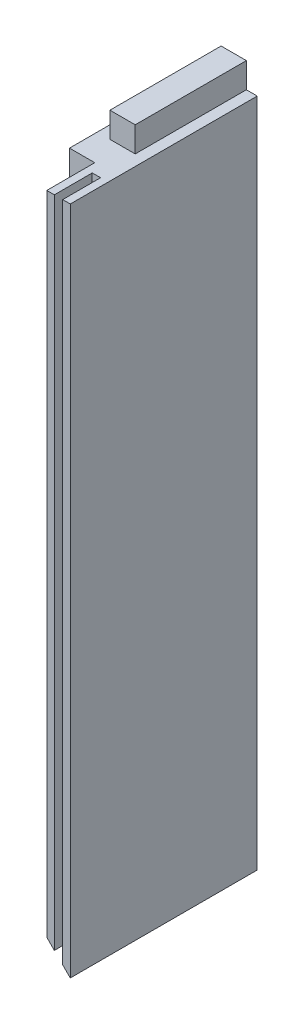
ISO-10303-21;
HEADER;
FILE_DESCRIPTION(('STEP AP214'),'2;1');
FILE_NAME('part.step','',(''),(''),'','','');
FILE_SCHEMA(('AUTOMOTIVE_DESIGN { 1 0 10303 214 1 1 1 1 }'));
ENDSEC;
DATA;
#1=APPLICATION_CONTEXT('core data for automotive mechanical design processes');
#2=APPLICATION_PROTOCOL_DEFINITION('international standard','automotive_design',2000,#1);
#3=PRODUCT_CONTEXT('',#1,'mechanical');
#4=PRODUCT('Part','Part','',(#3));
#5=PRODUCT_RELATED_PRODUCT_CATEGORY('part','',(#4));
#6=PRODUCT_DEFINITION_FORMATION('','',#4);
#7=PRODUCT_DEFINITION_CONTEXT('part definition',#1,'design');
#8=PRODUCT_DEFINITION('design','',#6,#7);
#9=PRODUCT_DEFINITION_SHAPE('','',#8);
#10=(LENGTH_UNIT() NAMED_UNIT(*) SI_UNIT(.MILLI.,.METRE.));
#11=(NAMED_UNIT(*) PLANE_ANGLE_UNIT() SI_UNIT($,.RADIAN.));
#12=(NAMED_UNIT(*) SI_UNIT($,.STERADIAN.) SOLID_ANGLE_UNIT());
#13=UNCERTAINTY_MEASURE_WITH_UNIT(LENGTH_MEASURE(1.E-05),#10,'distance_accuracy_value','');
#14=(GEOMETRIC_REPRESENTATION_CONTEXT(3) GLOBAL_UNCERTAINTY_ASSIGNED_CONTEXT((#13)) GLOBAL_UNIT_ASSIGNED_CONTEXT((#10,
#11,#12)) REPRESENTATION_CONTEXT('',''));
#15=CARTESIAN_POINT('',(0.,0.,0.));
#16=DIRECTION('',(0.,0.,1.));
#17=DIRECTION('',(1.,0.,0.));
#18=AXIS2_PLACEMENT_3D('',#15,#16,#17);
#19=CARTESIAN_POINT('',(-16.1028976870908,-16.1028976870907,0.));
#20=DIRECTION('',(-0.707106781186549,-0.707106781186546,0.));
#21=DIRECTION('',(0.707106781186546,-0.707106781186549,0.));
#22=AXIS2_PLACEMENT_3D('',#19,#20,#21);
#23=PLANE('',#22);
#24=DIRECTION('',(0.707106781186546,-0.707106781186549,0.));
#25=VECTOR('',#24,1.);
#26=CARTESIAN_POINT('',(-164.855795374181,132.65,-37.));
#27=LINE('',#26,#25);
#28=CARTESIAN_POINT('',(-51.5057953741814,19.3000000000001,-37.));
#29=VERTEX_POINT('',#28);
#30=CARTESIAN_POINT('',(-32.2057953741814,0.,-37.));
#31=VERTEX_POINT('',#30);
#32=EDGE_CURVE('E225',#29,#31,#27,.T.);
#33=ORIENTED_EDGE('',*,*,#32,.T.);
#34=DIRECTION('',(0.,0.,-1.));
#35=VECTOR('',#34,1.);
#36=CARTESIAN_POINT('',(-32.2057953741814,0.,37.));
#37=LINE('',#36,#35);
#38=CARTESIAN_POINT('',(-32.2057953741814,0.,37.));
#39=VERTEX_POINT('',#38);
#40=EDGE_CURVE('E266',#39,#31,#37,.T.);
#41=ORIENTED_EDGE('',*,*,#40,.F.);
#42=DIRECTION('',(-0.707106781186546,0.707106781186549,0.));
#43=VECTOR('',#42,1.);
#44=CARTESIAN_POINT('',(-166.355795374181,134.15,37.));
#45=LINE('',#44,#43);
#46=CARTESIAN_POINT('',(-35.2057953741814,2.99999999999995,37.));
#47=VERTEX_POINT('',#46);
#48=EDGE_CURVE('E196',#39,#47,#45,.T.);
#49=ORIENTED_EDGE('',*,*,#48,.T.);
#50=DIRECTION('',(0.,0.,-1.));
#51=VECTOR('',#50,1.);
#52=CARTESIAN_POINT('',(-35.2057953741814,3.,22.));
#53=LINE('',#52,#51);
#54=CARTESIAN_POINT('',(-35.2057953741814,3.,22.));
#55=VERTEX_POINT('',#54);
#56=EDGE_CURVE('E200',#47,#55,#53,.T.);
#57=ORIENTED_EDGE('',*,*,#56,.T.);
#58=DIRECTION('',(-0.707106781186546,0.707106781186549,0.));
#59=VECTOR('',#58,1.);
#60=CARTESIAN_POINT('',(-168.005795374181,135.8,22.));
#61=LINE('',#60,#59);
#62=CARTESIAN_POINT('',(-38.5057953741814,6.29999999999997,22.));
#63=VERTEX_POINT('',#62);
#64=EDGE_CURVE('E207',#55,#63,#61,.T.);
#65=ORIENTED_EDGE('',*,*,#64,.T.);
#66=DIRECTION('',(0.,0.,1.));
#67=VECTOR('',#66,1.);
#68=CARTESIAN_POINT('',(-38.5057953741814,6.30000000000003,37.));
#69=LINE('',#68,#67);
#70=CARTESIAN_POINT('',(-38.5057953741814,6.30000000000003,37.));
#71=VERTEX_POINT('',#70);
#72=EDGE_CURVE('E210',#63,#71,#69,.T.);
#73=ORIENTED_EDGE('',*,*,#72,.T.);
#74=DIRECTION('',(-0.707106781186546,0.707106781186549,0.));
#75=VECTOR('',#74,1.);
#76=CARTESIAN_POINT('',(-169.505795374181,137.3,37.));
#77=LINE('',#76,#75);
#78=CARTESIAN_POINT('',(-41.5057953741814,9.29999999999998,37.));
#79=VERTEX_POINT('',#78);
#80=EDGE_CURVE('E213',#71,#79,#77,.T.);
#81=ORIENTED_EDGE('',*,*,#80,.T.);
#82=DIRECTION('',(0.,0.,-1.));
#83=VECTOR('',#82,1.);
#84=CARTESIAN_POINT('',(-41.5057953741814,9.30000000000003,18.));
#85=LINE('',#84,#83);
#86=CARTESIAN_POINT('',(-41.5057953741814,9.30000000000003,18.));
#87=VERTEX_POINT('',#86);
#88=EDGE_CURVE('E216',#79,#87,#85,.T.);
#89=ORIENTED_EDGE('',*,*,#88,.T.);
#90=DIRECTION('',(-0.707106781186546,0.707106781186549,0.));
#91=VECTOR('',#90,1.);
#92=CARTESIAN_POINT('',(-174.505795374181,142.3,18.));
#93=LINE('',#92,#91);
#94=CARTESIAN_POINT('',(-51.5057953741814,19.3,18.));
#95=VERTEX_POINT('',#94);
#96=EDGE_CURVE('E219',#87,#95,#93,.T.);
#97=ORIENTED_EDGE('',*,*,#96,.T.);
#98=DIRECTION('',(0.,0.,-1.));
#99=VECTOR('',#98,1.);
#100=CARTESIAN_POINT('',(-51.5057953741814,19.3000000000001,-37.));
#101=LINE('',#100,#99);
#102=EDGE_CURVE('E222',#95,#29,#101,.T.);
#103=ORIENTED_EDGE('',*,*,#102,.T.);
#104=EDGE_LOOP('',(#33,#41,#49,#57,#65,#73,#81,#89,#97,#103));
#105=FACE_BOUND('',#104,.T.);
#106=DIRECTION('',(0.,0.,1.));
#107=VECTOR('',#106,1.);
#108=CARTESIAN_POINT('',(-42.3134072187563,10.1076118445749,-25.));
#109=LINE('',#108,#107);
#110=CARTESIAN_POINT('',(-42.3134072187563,10.1076118445749,-25.));
#111=VERTEX_POINT('',#110);
#112=CARTESIAN_POINT('',(-42.3134072187563,10.1076118445749,2.99999999999999));
#113=VERTEX_POINT('',#112);
#114=EDGE_CURVE('E624',#111,#113,#109,.T.);
#115=ORIENTED_EDGE('',*,*,#114,.F.);
#116=DIRECTION('',(0.707106781186546,-0.707106781186549,0.));
#117=VECTOR('',#116,1.);
#118=CARTESIAN_POINT('',(-47.2631546870621,15.0573593128807,-25.));
#119=LINE('',#118,#117);
#120=CARTESIAN_POINT('',(-47.2631546870621,15.0573593128807,-25.));
#121=VERTEX_POINT('',#120);
#122=EDGE_CURVE('E193',#121,#111,#119,.T.);
#123=ORIENTED_EDGE('',*,*,#122,.F.);
#124=DIRECTION('',(0.,0.,-1.));
#125=VECTOR('',#124,1.);
#126=CARTESIAN_POINT('',(-47.2631546870621,15.0573593128807,-25.));
#127=LINE('',#126,#125);
#128=CARTESIAN_POINT('',(-47.2631546870621,15.0573593128808,2.99999999999999));
#129=VERTEX_POINT('',#128);
#130=EDGE_CURVE('E189',#129,#121,#127,.T.);
#131=ORIENTED_EDGE('',*,*,#130,.F.);
#132=DIRECTION('',(-0.707106781186546,0.707106781186549,0.));
#133=VECTOR('',#132,1.);
#134=CARTESIAN_POINT('',(-47.2631546870621,15.0573593128807,2.99999999999999));
#135=LINE('',#134,#133);
#136=EDGE_CURVE('E620',#113,#129,#135,.T.);
#137=ORIENTED_EDGE('',*,*,#136,.F.);
#138=EDGE_LOOP('',(#115,#123,#131,#137));
#139=FACE_BOUND('',#138,.T.);
#140=ADVANCED_FACE('F42',(#105,#139),#23,.T.);
#141=CARTESIAN_POINT('',(-32.2057953741814,265.3,-37.));
#142=DIRECTION('',(0.,0.,1.));
#143=DIRECTION('',(1.,0.,0.));
#144=AXIS2_PLACEMENT_3D('',#141,#142,#143);
#145=PLANE('',#144);
#146=ORIENTED_EDGE('',*,*,#32,.F.);
#147=DIRECTION('',(0.,-1.,0.));
#148=VECTOR('',#147,1.);
#149=CARTESIAN_POINT('',(-51.5057953741814,265.3,-37.));
#150=LINE('',#149,#148);
#151=CARTESIAN_POINT('',(-51.5057953741814,265.3,-37.));
#152=VERTEX_POINT('',#151);
#153=EDGE_CURVE('E11',#152,#29,#150,.T.);
#154=ORIENTED_EDGE('',*,*,#153,.F.);
#155=DIRECTION('',(-1.,0.,0.));
#156=VECTOR('',#155,1.);
#157=CARTESIAN_POINT('',(-32.2057953741814,265.3,-37.));
#158=LINE('',#157,#156);
#159=CARTESIAN_POINT('',(-46.5057953741814,265.3,-37.));
#160=VERTEX_POINT('',#159);
#161=EDGE_CURVE('E271',#160,#152,#158,.T.);
#162=ORIENTED_EDGE('',*,*,#161,.F.);
#163=DIRECTION('',(0.,-1.,0.));
#164=VECTOR('',#163,1.);
#165=CARTESIAN_POINT('',(-46.5057953741814,275.3,-37.));
#166=LINE('',#165,#164);
#167=CARTESIAN_POINT('',(-46.5057953741814,275.3,-37.));
#168=VERTEX_POINT('',#167);
#169=EDGE_CURVE('E243',#168,#160,#166,.T.);
#170=ORIENTED_EDGE('',*,*,#169,.F.);
#171=DIRECTION('',(-1.,0.,0.));
#172=VECTOR('',#171,1.);
#173=CARTESIAN_POINT('',(-46.5057953741814,275.3,-37.));
#174=LINE('',#173,#172);
#175=CARTESIAN_POINT('',(-36.5057953741814,275.3,-37.));
#176=VERTEX_POINT('',#175);
#177=EDGE_CURVE('E240',#176,#168,#174,.T.);
#178=ORIENTED_EDGE('',*,*,#177,.F.);
#179=DIRECTION('',(0.,-1.,0.));
#180=VECTOR('',#179,1.);
#181=CARTESIAN_POINT('',(-36.5057953741814,275.3,-37.));
#182=LINE('',#181,#180);
#183=CARTESIAN_POINT('',(-36.5057953741814,265.3,-37.));
#184=VERTEX_POINT('',#183);
#185=EDGE_CURVE('E255',#176,#184,#182,.T.);
#186=ORIENTED_EDGE('',*,*,#185,.T.);
#187=CARTESIAN_POINT('',(-32.2057953741814,265.3,-37.));
#188=VERTEX_POINT('',#187);
#189=EDGE_CURVE('E267',#188,#184,#158,.T.);
#190=ORIENTED_EDGE('',*,*,#189,.F.);
#191=DIRECTION('',(0.,-1.,0.));
#192=VECTOR('',#191,1.);
#193=CARTESIAN_POINT('',(-32.2057953741814,265.3,-37.));
#194=LINE('',#193,#192);
#195=EDGE_CURVE('E298',#188,#31,#194,.T.);
#196=ORIENTED_EDGE('',*,*,#195,.T.);
#197=EDGE_LOOP('',(#146,#154,#162,#170,#178,#186,#190,#196));
#198=FACE_BOUND('',#197,.T.);
#199=ADVANCED_FACE('F44',(#198),#145,.F.);
#200=CARTESIAN_POINT('',(-51.5057953741814,265.3,-37.));
#201=DIRECTION('',(1.,0.,0.));
#202=DIRECTION('',(0.,0.,-1.));
#203=AXIS2_PLACEMENT_3D('',#200,#201,#202);
#204=PLANE('',#203);
#205=ORIENTED_EDGE('',*,*,#102,.F.);
#206=DIRECTION('',(0.,-1.,0.));
#207=VECTOR('',#206,1.);
#208=CARTESIAN_POINT('',(-51.5057953741814,265.3,18.));
#209=LINE('',#208,#207);
#210=CARTESIAN_POINT('',(-51.5057953741814,265.3,18.));
#211=VERTEX_POINT('',#210);
#212=EDGE_CURVE('E51',#211,#95,#209,.T.);
#213=ORIENTED_EDGE('',*,*,#212,.F.);
#214=DIRECTION('',(0.,0.,1.));
#215=VECTOR('',#214,1.);
#216=CARTESIAN_POINT('',(-51.5057953741814,265.3,-37.));
#217=LINE('',#216,#215);
#218=EDGE_CURVE('E270',#152,#211,#217,.T.);
#219=ORIENTED_EDGE('',*,*,#218,.F.);
#220=ORIENTED_EDGE('',*,*,#153,.T.);
#221=EDGE_LOOP('',(#205,#213,#219,#220));
#222=FACE_BOUND('',#221,.T.);
#223=ADVANCED_FACE('F343',(#222),#204,.F.);
#224=CARTESIAN_POINT('',(-51.5057953741814,265.3,18.));
#225=DIRECTION('',(0.,0.,-1.));
#226=DIRECTION('',(-1.,0.,0.));
#227=AXIS2_PLACEMENT_3D('',#224,#225,#226);
#228=PLANE('',#227);
#229=ORIENTED_EDGE('',*,*,#96,.F.);
#230=DIRECTION('',(0.,-1.,0.));
#231=VECTOR('',#230,1.);
#232=CARTESIAN_POINT('',(-41.5057953741814,265.3,18.));
#233=LINE('',#232,#231);
#234=CARTESIAN_POINT('',(-41.5057953741814,265.3,18.));
#235=VERTEX_POINT('',#234);
#236=EDGE_CURVE('E329',#235,#87,#233,.T.);
#237=ORIENTED_EDGE('',*,*,#236,.F.);
#238=DIRECTION('',(1.,0.,0.));
#239=VECTOR('',#238,1.);
#240=CARTESIAN_POINT('',(-51.5057953741814,265.3,18.));
#241=LINE('',#240,#239);
#242=EDGE_CURVE('E274',#211,#235,#241,.T.);
#243=ORIENTED_EDGE('',*,*,#242,.F.);
#244=ORIENTED_EDGE('',*,*,#212,.T.);
#245=EDGE_LOOP('',(#229,#237,#243,#244));
#246=FACE_BOUND('',#245,.T.);
#247=ADVANCED_FACE('F338',(#246),#228,.F.);
#248=CARTESIAN_POINT('',(-41.5057953741814,265.3,18.));
#249=DIRECTION('',(1.,0.,0.));
#250=DIRECTION('',(0.,0.,-1.));
#251=AXIS2_PLACEMENT_3D('',#248,#249,#250);
#252=PLANE('',#251);
#253=ORIENTED_EDGE('',*,*,#88,.F.);
#254=DIRECTION('',(0.,-1.,0.));
#255=VECTOR('',#254,1.);
#256=CARTESIAN_POINT('',(-41.5057953741814,265.3,37.));
#257=LINE('',#256,#255);
#258=CARTESIAN_POINT('',(-41.5057953741814,265.3,37.));
#259=VERTEX_POINT('',#258);
#260=EDGE_CURVE('E325',#259,#79,#257,.T.);
#261=ORIENTED_EDGE('',*,*,#260,.F.);
#262=DIRECTION('',(0.,0.,1.));
#263=VECTOR('',#262,1.);
#264=CARTESIAN_POINT('',(-41.5057953741814,265.3,18.));
#265=LINE('',#264,#263);
#266=EDGE_CURVE('E277',#235,#259,#265,.T.);
#267=ORIENTED_EDGE('',*,*,#266,.F.);
#268=ORIENTED_EDGE('',*,*,#236,.T.);
#269=EDGE_LOOP('',(#253,#261,#267,#268));
#270=FACE_BOUND('',#269,.T.);
#271=ADVANCED_FACE('F384',(#270),#252,.F.);
#272=CARTESIAN_POINT('',(-41.5057953741814,265.3,37.));
#273=DIRECTION('',(0.,0.,-1.));
#274=DIRECTION('',(-1.,0.,0.));
#275=AXIS2_PLACEMENT_3D('',#272,#273,#274);
#276=PLANE('',#275);
#277=ORIENTED_EDGE('',*,*,#80,.F.);
#278=DIRECTION('',(0.,-1.,0.));
#279=VECTOR('',#278,1.);
#280=CARTESIAN_POINT('',(-38.5057953741814,265.3,37.));
#281=LINE('',#280,#279);
#282=CARTESIAN_POINT('',(-38.5057953741814,265.3,37.));
#283=VERTEX_POINT('',#282);
#284=EDGE_CURVE('E321',#283,#71,#281,.T.);
#285=ORIENTED_EDGE('',*,*,#284,.F.);
#286=DIRECTION('',(1.,0.,0.));
#287=VECTOR('',#286,1.);
#288=CARTESIAN_POINT('',(-41.5057953741814,265.3,37.));
#289=LINE('',#288,#287);
#290=EDGE_CURVE('E280',#259,#283,#289,.T.);
#291=ORIENTED_EDGE('',*,*,#290,.F.);
#292=ORIENTED_EDGE('',*,*,#260,.T.);
#293=EDGE_LOOP('',(#277,#285,#291,#292));
#294=FACE_BOUND('',#293,.T.);
#295=ADVANCED_FACE('F379',(#294),#276,.F.);
#296=CARTESIAN_POINT('',(-38.5057953741814,265.3,37.));
#297=DIRECTION('',(-1.,0.,0.));
#298=DIRECTION('',(0.,0.,1.));
#299=AXIS2_PLACEMENT_3D('',#296,#297,#298);
#300=PLANE('',#299);
#301=ORIENTED_EDGE('',*,*,#72,.F.);
#302=DIRECTION('',(0.,-1.,0.));
#303=VECTOR('',#302,1.);
#304=CARTESIAN_POINT('',(-38.5057953741814,265.3,22.));
#305=LINE('',#304,#303);
#306=CARTESIAN_POINT('',(-38.5057953741814,265.3,22.));
#307=VERTEX_POINT('',#306);
#308=EDGE_CURVE('E317',#307,#63,#305,.T.);
#309=ORIENTED_EDGE('',*,*,#308,.F.);
#310=DIRECTION('',(0.,0.,-1.));
#311=VECTOR('',#310,1.);
#312=CARTESIAN_POINT('',(-38.5057953741814,265.3,37.));
#313=LINE('',#312,#311);
#314=EDGE_CURVE('E283',#283,#307,#313,.T.);
#315=ORIENTED_EDGE('',*,*,#314,.F.);
#316=ORIENTED_EDGE('',*,*,#284,.T.);
#317=EDGE_LOOP('',(#301,#309,#315,#316));
#318=FACE_BOUND('',#317,.T.);
#319=ADVANCED_FACE('F374',(#318),#300,.F.);
#320=CARTESIAN_POINT('',(-38.5057953741814,265.3,22.));
#321=DIRECTION('',(0.,0.,-1.));
#322=DIRECTION('',(-1.,0.,0.));
#323=AXIS2_PLACEMENT_3D('',#320,#321,#322);
#324=PLANE('',#323);
#325=ORIENTED_EDGE('',*,*,#64,.F.);
#326=DIRECTION('',(0.,-1.,0.));
#327=VECTOR('',#326,1.);
#328=CARTESIAN_POINT('',(-35.2057953741814,265.3,22.));
#329=LINE('',#328,#327);
#330=CARTESIAN_POINT('',(-35.2057953741814,265.3,22.));
#331=VERTEX_POINT('',#330);
#332=EDGE_CURVE('E313',#331,#55,#329,.T.);
#333=ORIENTED_EDGE('',*,*,#332,.F.);
#334=DIRECTION('',(1.,0.,0.));
#335=VECTOR('',#334,1.);
#336=CARTESIAN_POINT('',(-38.5057953741814,265.3,22.));
#337=LINE('',#336,#335);
#338=EDGE_CURVE('E286',#307,#331,#337,.T.);
#339=ORIENTED_EDGE('',*,*,#338,.F.);
#340=ORIENTED_EDGE('',*,*,#308,.T.);
#341=EDGE_LOOP('',(#325,#333,#339,#340));
#342=FACE_BOUND('',#341,.T.);
#343=ADVANCED_FACE('F369',(#342),#324,.F.);
#344=CARTESIAN_POINT('',(-35.2057953741814,265.3,22.));
#345=DIRECTION('',(1.,0.,0.));
#346=DIRECTION('',(0.,0.,-1.));
#347=AXIS2_PLACEMENT_3D('',#344,#345,#346);
#348=PLANE('',#347);
#349=ORIENTED_EDGE('',*,*,#56,.F.);
#350=DIRECTION('',(0.,-1.,0.));
#351=VECTOR('',#350,1.);
#352=CARTESIAN_POINT('',(-35.2057953741814,265.3,37.));
#353=LINE('',#352,#351);
#354=CARTESIAN_POINT('',(-35.2057953741814,265.3,37.));
#355=VERTEX_POINT('',#354);
#356=EDGE_CURVE('E309',#355,#47,#353,.T.);
#357=ORIENTED_EDGE('',*,*,#356,.F.);
#358=DIRECTION('',(0.,0.,1.));
#359=VECTOR('',#358,1.);
#360=CARTESIAN_POINT('',(-35.2057953741814,265.3,22.));
#361=LINE('',#360,#359);
#362=EDGE_CURVE('E289',#331,#355,#361,.T.);
#363=ORIENTED_EDGE('',*,*,#362,.F.);
#364=ORIENTED_EDGE('',*,*,#332,.T.);
#365=EDGE_LOOP('',(#349,#357,#363,#364));
#366=FACE_BOUND('',#365,.T.);
#367=ADVANCED_FACE('F364',(#366),#348,.F.);
#368=CARTESIAN_POINT('',(-35.2057953741814,265.3,37.));
#369=DIRECTION('',(0.,0.,-1.));
#370=DIRECTION('',(-1.,0.,0.));
#371=AXIS2_PLACEMENT_3D('',#368,#369,#370);
#372=PLANE('',#371);
#373=ORIENTED_EDGE('',*,*,#48,.F.);
#374=DIRECTION('',(0.,-1.,0.));
#375=VECTOR('',#374,1.);
#376=CARTESIAN_POINT('',(-32.2057953741814,265.3,37.));
#377=LINE('',#376,#375);
#378=CARTESIAN_POINT('',(-32.2057953741814,265.3,37.));
#379=VERTEX_POINT('',#378);
#380=EDGE_CURVE('E305',#379,#39,#377,.T.);
#381=ORIENTED_EDGE('',*,*,#380,.F.);
#382=DIRECTION('',(1.,0.,0.));
#383=VECTOR('',#382,1.);
#384=CARTESIAN_POINT('',(-35.2057953741814,265.3,37.));
#385=LINE('',#384,#383);
#386=EDGE_CURVE('E292',#355,#379,#385,.T.);
#387=ORIENTED_EDGE('',*,*,#386,.F.);
#388=ORIENTED_EDGE('',*,*,#356,.T.);
#389=EDGE_LOOP('',(#373,#381,#387,#388));
#390=FACE_BOUND('',#389,.T.);
#391=ADVANCED_FACE('F359',(#390),#372,.F.);
#392=CARTESIAN_POINT('',(-32.2057953741814,265.3,37.));
#393=DIRECTION('',(-1.,0.,0.));
#394=DIRECTION('',(0.,0.,1.));
#395=AXIS2_PLACEMENT_3D('',#392,#393,#394);
#396=PLANE('',#395);
#397=ORIENTED_EDGE('',*,*,#40,.T.);
#398=ORIENTED_EDGE('',*,*,#195,.F.);
#399=DIRECTION('',(0.,0.,-1.));
#400=VECTOR('',#399,1.);
#401=CARTESIAN_POINT('',(-32.2057953741814,265.3,37.));
#402=LINE('',#401,#400);
#403=EDGE_CURVE('E295',#379,#188,#402,.T.);
#404=ORIENTED_EDGE('',*,*,#403,.F.);
#405=ORIENTED_EDGE('',*,*,#380,.T.);
#406=EDGE_LOOP('',(#397,#398,#404,#405));
#407=FACE_BOUND('',#406,.T.);
#408=ADVANCED_FACE('F354',(#407),#396,.F.);
#409=CARTESIAN_POINT('',(0.,265.3,0.));
#410=DIRECTION('',(0.,1.,0.));
#411=DIRECTION('',(0.,0.,1.));
#412=AXIS2_PLACEMENT_3D('',#409,#410,#411);
#413=PLANE('',#412);
#414=DIRECTION('',(0.,0.,1.));
#415=VECTOR('',#414,1.);
#416=CARTESIAN_POINT('',(-46.5057953741814,265.3,7.));
#417=LINE('',#416,#415);
#418=CARTESIAN_POINT('',(-46.5057953741814,265.3,7.));
#419=VERTEX_POINT('',#418);
#420=EDGE_CURVE('E228',#160,#419,#417,.T.);
#421=ORIENTED_EDGE('',*,*,#420,.F.);
#422=ORIENTED_EDGE('',*,*,#161,.T.);
#423=ORIENTED_EDGE('',*,*,#218,.T.);
#424=ORIENTED_EDGE('',*,*,#242,.T.);
#425=ORIENTED_EDGE('',*,*,#266,.T.);
#426=ORIENTED_EDGE('',*,*,#290,.T.);
#427=ORIENTED_EDGE('',*,*,#314,.T.);
#428=ORIENTED_EDGE('',*,*,#338,.T.);
#429=ORIENTED_EDGE('',*,*,#362,.T.);
#430=ORIENTED_EDGE('',*,*,#386,.T.);
#431=ORIENTED_EDGE('',*,*,#403,.T.);
#432=ORIENTED_EDGE('',*,*,#189,.T.);
#433=DIRECTION('',(0.,0.,-1.));
#434=VECTOR('',#433,1.);
#435=CARTESIAN_POINT('',(-36.5057953741814,265.3,-37.));
#436=LINE('',#435,#434);
#437=CARTESIAN_POINT('',(-36.5057953741814,265.3,7.));
#438=VERTEX_POINT('',#437);
#439=EDGE_CURVE('E234',#438,#184,#436,.T.);
#440=ORIENTED_EDGE('',*,*,#439,.F.);
#441=DIRECTION('',(1.,0.,0.));
#442=VECTOR('',#441,1.);
#443=CARTESIAN_POINT('',(-36.5057953741814,265.3,7.));
#444=LINE('',#443,#442);
#445=EDGE_CURVE('E66',#419,#438,#444,.T.);
#446=ORIENTED_EDGE('',*,*,#445,.F.);
#447=EDGE_LOOP('',(#421,#422,#423,#424,#425,#426,#427,#428,#429,#430,#431,#432,#440,#446));
#448=FACE_BOUND('',#447,.T.);
#449=ADVANCED_FACE('F385',(#448),#413,.T.);
#450=CARTESIAN_POINT('',(-46.5057953741814,275.3,7.));
#451=DIRECTION('',(1.,0.,0.));
#452=DIRECTION('',(0.,0.,-1.));
#453=AXIS2_PLACEMENT_3D('',#450,#451,#452);
#454=PLANE('',#453);
#455=ORIENTED_EDGE('',*,*,#420,.T.);
#456=DIRECTION('',(0.,-1.,0.));
#457=VECTOR('',#456,1.);
#458=CARTESIAN_POINT('',(-46.5057953741814,275.3,7.));
#459=LINE('',#458,#457);
#460=CARTESIAN_POINT('',(-46.5057953741814,275.3,7.));
#461=VERTEX_POINT('',#460);
#462=EDGE_CURVE('E263',#461,#419,#459,.T.);
#463=ORIENTED_EDGE('',*,*,#462,.F.);
#464=DIRECTION('',(0.,0.,1.));
#465=VECTOR('',#464,1.);
#466=CARTESIAN_POINT('',(-46.5057953741814,275.3,7.));
#467=LINE('',#466,#465);
#468=EDGE_CURVE('E229',#168,#461,#467,.T.);
#469=ORIENTED_EDGE('',*,*,#468,.F.);
#470=ORIENTED_EDGE('',*,*,#169,.T.);
#471=EDGE_LOOP('',(#455,#463,#469,#470));
#472=FACE_BOUND('',#471,.T.);
#473=ADVANCED_FACE('F391',(#472),#454,.F.);
#474=CARTESIAN_POINT('',(-36.5057953741814,275.3,7.));
#475=DIRECTION('',(0.,0.,-1.));
#476=DIRECTION('',(-1.,0.,0.));
#477=AXIS2_PLACEMENT_3D('',#474,#475,#476);
#478=PLANE('',#477);
#479=ORIENTED_EDGE('',*,*,#445,.T.);
#480=DIRECTION('',(0.,-1.,0.));
#481=VECTOR('',#480,1.);
#482=CARTESIAN_POINT('',(-36.5057953741814,275.3,7.));
#483=LINE('',#482,#481);
#484=CARTESIAN_POINT('',(-36.5057953741814,275.3,7.));
#485=VERTEX_POINT('',#484);
#486=EDGE_CURVE('E259',#485,#438,#483,.T.);
#487=ORIENTED_EDGE('',*,*,#486,.F.);
#488=DIRECTION('',(1.,0.,0.));
#489=VECTOR('',#488,1.);
#490=CARTESIAN_POINT('',(-36.5057953741814,275.3,7.));
#491=LINE('',#490,#489);
#492=EDGE_CURVE('E233',#461,#485,#491,.T.);
#493=ORIENTED_EDGE('',*,*,#492,.F.);
#494=ORIENTED_EDGE('',*,*,#462,.T.);
#495=EDGE_LOOP('',(#479,#487,#493,#494));
#496=FACE_BOUND('',#495,.T.);
#497=ADVANCED_FACE('F401',(#496),#478,.F.);
#498=CARTESIAN_POINT('',(-36.5057953741814,275.3,-37.));
#499=DIRECTION('',(-1.,0.,0.));
#500=DIRECTION('',(0.,0.,1.));
#501=AXIS2_PLACEMENT_3D('',#498,#499,#500);
#502=PLANE('',#501);
#503=ORIENTED_EDGE('',*,*,#439,.T.);
#504=ORIENTED_EDGE('',*,*,#185,.F.);
#505=DIRECTION('',(0.,0.,-1.));
#506=VECTOR('',#505,1.);
#507=CARTESIAN_POINT('',(-36.5057953741814,275.3,-37.));
#508=LINE('',#507,#506);
#509=EDGE_CURVE('E237',#485,#176,#508,.T.);
#510=ORIENTED_EDGE('',*,*,#509,.F.);
#511=ORIENTED_EDGE('',*,*,#486,.T.);
#512=EDGE_LOOP('',(#503,#504,#510,#511));
#513=FACE_BOUND('',#512,.T.);
#514=ADVANCED_FACE('F399',(#513),#502,.F.);
#515=CARTESIAN_POINT('',(0.,275.3,0.));
#516=DIRECTION('',(0.,-1.,0.));
#517=DIRECTION('',(0.,0.,-1.));
#518=AXIS2_PLACEMENT_3D('',#515,#516,#517);
#519=PLANE('',#518);
#520=ORIENTED_EDGE('',*,*,#468,.T.);
#521=ORIENTED_EDGE('',*,*,#492,.T.);
#522=ORIENTED_EDGE('',*,*,#509,.T.);
#523=ORIENTED_EDGE('',*,*,#177,.T.);
#524=EDGE_LOOP('',(#520,#521,#522,#523));
#525=FACE_BOUND('',#524,.T.);
#526=ADVANCED_FACE('F394',(#525),#519,.F.);
#527=CARTESIAN_POINT('',(-52.212902155368,10.1076118445749,-25.));
#528=DIRECTION('',(0.,0.,1.));
#529=DIRECTION('',(0.,-1.,0.));
#530=AXIS2_PLACEMENT_3D('',#527,#528,#529);
#531=PLANE('',#530);
#532=ORIENTED_EDGE('',*,*,#122,.T.);
#533=DIRECTION('',(0.707106781186549,0.707106781186546,0.));
#534=VECTOR('',#533,1.);
#535=CARTESIAN_POINT('',(-47.2631546870622,5.15786437626908,-25.));
#536=LINE('',#535,#534);
#537=CARTESIAN_POINT('',(-47.2631546870622,5.15786437626908,-25.));
#538=VERTEX_POINT('',#537);
#539=EDGE_CURVE('E172',#538,#111,#536,.T.);
#540=ORIENTED_EDGE('',*,*,#539,.F.);
#541=DIRECTION('',(0.707106781186546,-0.707106781186549,0.));
#542=VECTOR('',#541,1.);
#543=CARTESIAN_POINT('',(-52.212902155368,10.1076118445749,-25.));
#544=LINE('',#543,#542);
#545=CARTESIAN_POINT('',(-52.212902155368,10.1076118445749,-25.));
#546=VERTEX_POINT('',#545);
#547=EDGE_CURVE('E180',#546,#538,#544,.T.);
#548=ORIENTED_EDGE('',*,*,#547,.F.);
#549=DIRECTION('',(0.707106781186549,0.707106781186546,0.));
#550=VECTOR('',#549,1.);
#551=CARTESIAN_POINT('',(-52.212902155368,10.1076118445749,-25.));
#552=LINE('',#551,#550);
#553=EDGE_CURVE('E617',#546,#121,#552,.T.);
#554=ORIENTED_EDGE('',*,*,#553,.T.);
#555=EDGE_LOOP('',(#532,#540,#548,#554));
#556=FACE_BOUND('',#555,.T.);
#557=ADVANCED_FACE('F191',(#556),#531,.F.);
#558=CARTESIAN_POINT('',(-47.2631546870622,5.15786437626908,-25.));
#559=DIRECTION('',(-0.707106781186546,0.707106781186549,0.));
#560=DIRECTION('',(-0.707106781186549,-0.707106781186546,0.));
#561=AXIS2_PLACEMENT_3D('',#558,#559,#560);
#562=PLANE('',#561);
#563=ORIENTED_EDGE('',*,*,#114,.T.);
#564=DIRECTION('',(0.707106781186549,0.707106781186546,0.));
#565=VECTOR('',#564,1.);
#566=CARTESIAN_POINT('',(-47.2631546870622,5.15786437626908,2.99999999999999));
#567=LINE('',#566,#565);
#568=CARTESIAN_POINT('',(-47.2631546870622,5.15786437626908,2.99999999999999));
#569=VERTEX_POINT('',#568);
#570=EDGE_CURVE('E175',#569,#113,#567,.T.);
#571=ORIENTED_EDGE('',*,*,#570,.F.);
#572=DIRECTION('',(0.,0.,1.));
#573=VECTOR('',#572,1.);
#574=CARTESIAN_POINT('',(-47.2631546870622,5.15786437626908,-25.));
#575=LINE('',#574,#573);
#576=EDGE_CURVE('E168',#538,#569,#575,.T.);
#577=ORIENTED_EDGE('',*,*,#576,.F.);
#578=ORIENTED_EDGE('',*,*,#539,.T.);
#579=EDGE_LOOP('',(#563,#571,#577,#578));
#580=FACE_BOUND('',#579,.T.);
#581=ADVANCED_FACE('F170',(#580),#562,.F.);
#582=CARTESIAN_POINT('',(-52.212902155368,10.1076118445749,2.99999999999999));
#583=DIRECTION('',(0.,0.,-1.));
#584=DIRECTION('',(0.,1.,0.));
#585=AXIS2_PLACEMENT_3D('',#582,#583,#584);
#586=PLANE('',#585);
#587=ORIENTED_EDGE('',*,*,#136,.T.);
#588=DIRECTION('',(0.707106781186549,0.707106781186546,0.));
#589=VECTOR('',#588,1.);
#590=CARTESIAN_POINT('',(-52.212902155368,10.1076118445749,2.99999999999999));
#591=LINE('',#590,#589);
#592=CARTESIAN_POINT('',(-52.212902155368,10.1076118445749,2.99999999999999));
#593=VERTEX_POINT('',#592);
#594=EDGE_CURVE('E58',#593,#129,#591,.T.);
#595=ORIENTED_EDGE('',*,*,#594,.F.);
#596=DIRECTION('',(-0.707106781186546,0.707106781186549,0.));
#597=VECTOR('',#596,1.);
#598=CARTESIAN_POINT('',(-52.212902155368,10.1076118445749,2.99999999999999));
#599=LINE('',#598,#597);
#600=EDGE_CURVE('E179',#569,#593,#599,.T.);
#601=ORIENTED_EDGE('',*,*,#600,.F.);
#602=ORIENTED_EDGE('',*,*,#570,.T.);
#603=EDGE_LOOP('',(#587,#595,#601,#602));
#604=FACE_BOUND('',#603,.T.);
#605=ADVANCED_FACE('F425',(#604),#586,.F.);
#606=CARTESIAN_POINT('',(-52.212902155368,10.1076118445749,-25.));
#607=DIRECTION('',(0.707106781186546,-0.707106781186549,0.));
#608=DIRECTION('',(0.707106781186549,0.707106781186546,0.));
#609=AXIS2_PLACEMENT_3D('',#606,#607,#608);
#610=PLANE('',#609);
#611=ORIENTED_EDGE('',*,*,#130,.T.);
#612=ORIENTED_EDGE('',*,*,#553,.F.);
#613=DIRECTION('',(0.,0.,-1.));
#614=VECTOR('',#613,1.);
#615=CARTESIAN_POINT('',(-52.212902155368,10.1076118445749,-25.));
#616=LINE('',#615,#614);
#617=EDGE_CURVE('E184',#593,#546,#616,.T.);
#618=ORIENTED_EDGE('',*,*,#617,.F.);
#619=ORIENTED_EDGE('',*,*,#594,.T.);
#620=EDGE_LOOP('',(#611,#612,#618,#619));
#621=FACE_BOUND('',#620,.T.);
#622=ADVANCED_FACE('F429',(#621),#610,.F.);
#623=CARTESIAN_POINT('',(-21.0526451553966,-21.0526451553966,0.));
#624=DIRECTION('',(-0.707106781186549,-0.707106781186546,0.));
#625=DIRECTION('',(0.707106781186546,-0.707106781186549,0.));
#626=AXIS2_PLACEMENT_3D('',#623,#624,#625);
#627=PLANE('',#626);
#628=ORIENTED_EDGE('',*,*,#547,.T.);
#629=ORIENTED_EDGE('',*,*,#576,.T.);
#630=ORIENTED_EDGE('',*,*,#600,.T.);
#631=ORIENTED_EDGE('',*,*,#617,.T.);
#632=EDGE_LOOP('',(#628,#629,#630,#631));
#633=FACE_BOUND('',#632,.T.);
#634=ADVANCED_FACE('F183',(#633),#627,.T.);
#635=CLOSED_SHELL('',(#140,#199,#223,#247,#271,#295,#319,#343,#367,#391,#408,#449,#473,#497,
#514,#526,#557,#581,#605,#622,#634));
#636=MANIFOLD_SOLID_BREP('B2',#635);
#637=ADVANCED_BREP_SHAPE_REPRESENTATION('',(#18,#636),#14);
#638=SHAPE_DEFINITION_REPRESENTATION(#9,#637);
ENDSEC;
END-ISO-10303-21;
